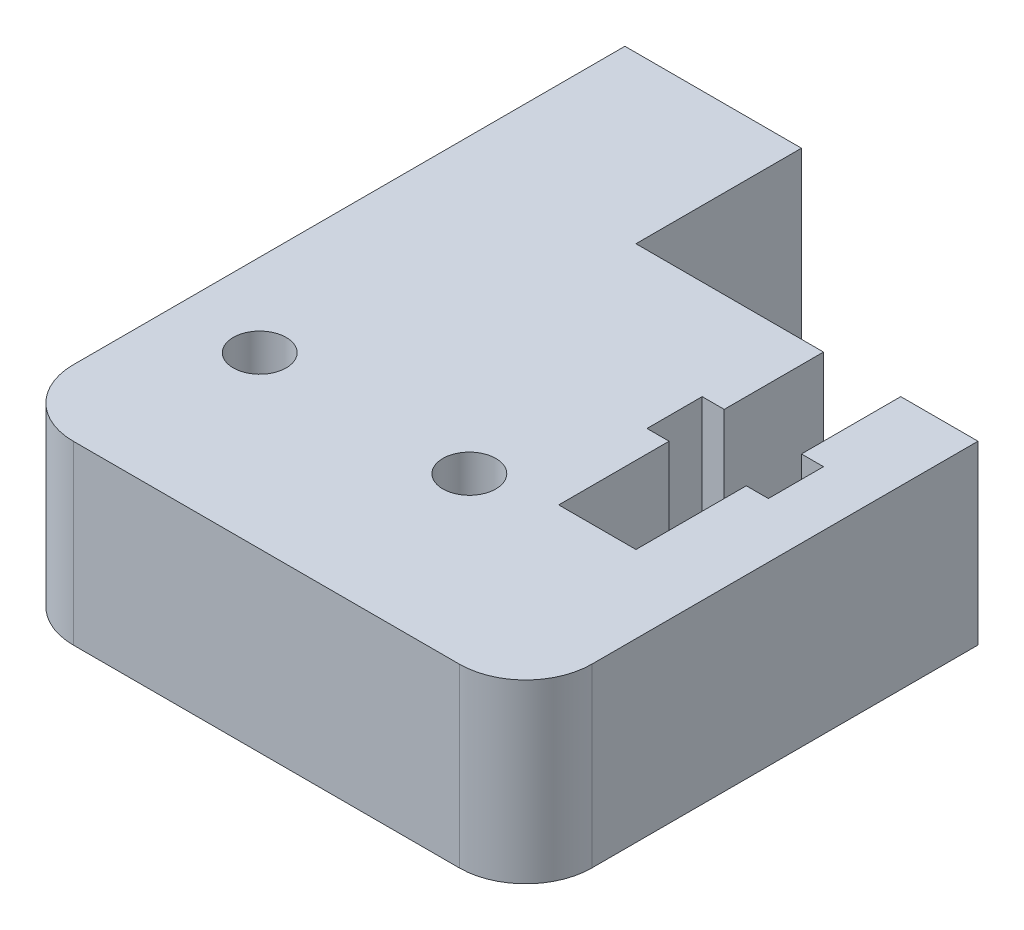
ISO-10303-21;
HEADER;
FILE_DESCRIPTION(('STEP AP214'),'2;1');
FILE_NAME('part.step','',(''),(''),'','','');
FILE_SCHEMA(('AUTOMOTIVE_DESIGN { 1 0 10303 214 1 1 1 1 }'));
ENDSEC;
DATA;
#1=APPLICATION_CONTEXT('core data for automotive mechanical design processes');
#2=APPLICATION_PROTOCOL_DEFINITION('international standard','automotive_design',2000,#1);
#3=PRODUCT_CONTEXT('',#1,'mechanical');
#4=PRODUCT('Part','Part','',(#3));
#5=PRODUCT_RELATED_PRODUCT_CATEGORY('part','',(#4));
#6=PRODUCT_DEFINITION_FORMATION('','',#4);
#7=PRODUCT_DEFINITION_CONTEXT('part definition',#1,'design');
#8=PRODUCT_DEFINITION('design','',#6,#7);
#9=PRODUCT_DEFINITION_SHAPE('','',#8);
#10=(LENGTH_UNIT() NAMED_UNIT(*) SI_UNIT(.MILLI.,.METRE.));
#11=(NAMED_UNIT(*) PLANE_ANGLE_UNIT() SI_UNIT($,.RADIAN.));
#12=(NAMED_UNIT(*) SI_UNIT($,.STERADIAN.) SOLID_ANGLE_UNIT());
#13=UNCERTAINTY_MEASURE_WITH_UNIT(LENGTH_MEASURE(1.E-05),#10,'distance_accuracy_value','');
#14=(GEOMETRIC_REPRESENTATION_CONTEXT(3) GLOBAL_UNCERTAINTY_ASSIGNED_CONTEXT((#13)) GLOBAL_UNIT_ASSIGNED_CONTEXT((#10,
#11,#12)) REPRESENTATION_CONTEXT('',''));
#15=CARTESIAN_POINT('',(0.,0.,0.));
#16=DIRECTION('',(0.,0.,1.));
#17=DIRECTION('',(1.,0.,0.));
#18=AXIS2_PLACEMENT_3D('',#15,#16,#17);
#19=CARTESIAN_POINT('',(30.4198055675083,8.,-12.9696334852867));
#20=DIRECTION('',(0.,1.,0.));
#21=DIRECTION('',(0.,0.,1.));
#22=AXIS2_PLACEMENT_3D('',#19,#20,#21);
#23=PLANE('',#22);
#24=CARTESIAN_POINT('',(23.1698055675083,8.,-17.6696334852865));
#25=DIRECTION('',(0.,1.,0.));
#26=DIRECTION('',(0.,0.,1.));
#27=AXIS2_PLACEMENT_3D('',#24,#25,#26);
#28=CIRCLE('',#27,1.2);
#29=CARTESIAN_POINT('',(23.1698055675083,8.,-16.4696334852865));
#30=VERTEX_POINT('',#29);
#31=EDGE_CURVE('E210',#30,#30,#28,.T.);
#32=ORIENTED_EDGE('',*,*,#31,.F.);
#33=EDGE_LOOP('',(#32));
#34=FACE_BOUND('',#33,.T.);
#35=DIRECTION('',(-1.,0.,0.));
#36=VECTOR('',#35,1.);
#37=CARTESIAN_POINT('',(17.9198055675083,8.,-30.4696334852867));
#38=LINE('',#37,#36);
#39=CARTESIAN_POINT('',(26.4198055675083,8.,-30.4696334852867));
#40=VERTEX_POINT('',#39);
#41=CARTESIAN_POINT('',(17.9198055675083,8.,-30.4696334852867));
#42=VERTEX_POINT('',#41);
#43=EDGE_CURVE('E246',#40,#42,#38,.T.);
#44=ORIENTED_EDGE('',*,*,#43,.T.);
#45=DIRECTION('',(0.,0.,-1.));
#46=VECTOR('',#45,1.);
#47=CARTESIAN_POINT('',(17.9198055675083,8.,-37.9696334852867));
#48=LINE('',#47,#46);
#49=CARTESIAN_POINT('',(17.9198055675083,8.,-37.9696334852867));
#50=VERTEX_POINT('',#49);
#51=EDGE_CURVE('E133',#42,#50,#48,.T.);
#52=ORIENTED_EDGE('',*,*,#51,.T.);
#53=DIRECTION('',(-1.,0.,0.));
#54=VECTOR('',#53,1.);
#55=CARTESIAN_POINT('',(9.91980556750833,8.,-37.9696334852867));
#56=LINE('',#55,#54);
#57=CARTESIAN_POINT('',(9.91980556750833,8.,-37.9696334852867));
#58=VERTEX_POINT('',#57);
#59=EDGE_CURVE('E297',#50,#58,#56,.T.);
#60=ORIENTED_EDGE('',*,*,#59,.T.);
#61=DIRECTION('',(0.,0.,1.));
#62=VECTOR('',#61,1.);
#63=CARTESIAN_POINT('',(9.91980556750833,8.,-30.4696334852867));
#64=LINE('',#63,#62);
#65=CARTESIAN_POINT('',(9.91980556750833,8.,-12.9696334852867));
#66=VERTEX_POINT('',#65);
#67=EDGE_CURVE('E315',#58,#66,#64,.T.);
#68=ORIENTED_EDGE('',*,*,#67,.T.);
#69=CARTESIAN_POINT('',(12.9198055675083,8.,-12.9696334852867));
#70=DIRECTION('',(0.,1.,0.));
#71=DIRECTION('',(0.,0.,1.));
#72=AXIS2_PLACEMENT_3D('',#69,#70,#71);
#73=CIRCLE('',#72,3.);
#74=CARTESIAN_POINT('',(12.9198055675083,8.,-9.96963348528671));
#75=VERTEX_POINT('',#74);
#76=EDGE_CURVE('E312',#66,#75,#73,.T.);
#77=ORIENTED_EDGE('',*,*,#76,.T.);
#78=DIRECTION('',(1.,0.,0.));
#79=VECTOR('',#78,1.);
#80=CARTESIAN_POINT('',(30.4198055675083,8.,-9.96963348528671));
#81=LINE('',#80,#79);
#82=CARTESIAN_POINT('',(30.4198055675083,8.,-9.96963348528671));
#83=VERTEX_POINT('',#82);
#84=EDGE_CURVE('E314',#75,#83,#81,.T.);
#85=ORIENTED_EDGE('',*,*,#84,.T.);
#86=CARTESIAN_POINT('',(30.4198055675083,8.,-12.9696334852867));
#87=DIRECTION('',(0.,1.,0.));
#88=DIRECTION('',(0.,0.,1.));
#89=AXIS2_PLACEMENT_3D('',#86,#87,#88);
#90=CIRCLE('',#89,3.);
#91=CARTESIAN_POINT('',(33.4198055675083,8.,-12.9696334852867));
#92=VERTEX_POINT('',#91);
#93=EDGE_CURVE('E317',#83,#92,#90,.T.);
#94=ORIENTED_EDGE('',*,*,#93,.T.);
#95=DIRECTION('',(0.,0.,-1.));
#96=VECTOR('',#95,1.);
#97=CARTESIAN_POINT('',(33.4198055675083,8.,-30.4696334852867));
#98=LINE('',#97,#96);
#99=CARTESIAN_POINT('',(33.4198055675083,8.,-30.4696334852867));
#100=VERTEX_POINT('',#99);
#101=EDGE_CURVE('E323',#92,#100,#98,.T.);
#102=ORIENTED_EDGE('',*,*,#101,.T.);
#103=DIRECTION('',(-1.,0.,0.));
#104=VECTOR('',#103,1.);
#105=CARTESIAN_POINT('',(29.9198055675083,8.,-30.4696334852867));
#106=LINE('',#105,#104);
#107=CARTESIAN_POINT('',(29.9198055675083,8.,-30.4696334852867));
#108=VERTEX_POINT('',#107);
#109=EDGE_CURVE('E325',#100,#108,#106,.T.);
#110=ORIENTED_EDGE('',*,*,#109,.T.);
#111=DIRECTION('',(0.,0.,1.));
#112=VECTOR('',#111,1.);
#113=CARTESIAN_POINT('',(29.9198055675083,8.,-25.9696334852867));
#114=LINE('',#113,#112);
#115=CARTESIAN_POINT('',(29.9198055675083,8.,-25.9696334852867));
#116=VERTEX_POINT('',#115);
#117=EDGE_CURVE('E327',#108,#116,#114,.T.);
#118=ORIENTED_EDGE('',*,*,#117,.T.);
#119=DIRECTION('',(1.,0.,0.));
#120=VECTOR('',#119,1.);
#121=CARTESIAN_POINT('',(30.9198055675083,8.,-25.9696334852867));
#122=LINE('',#121,#120);
#123=CARTESIAN_POINT('',(30.9198055675083,8.,-25.9696334852867));
#124=VERTEX_POINT('',#123);
#125=EDGE_CURVE('E329',#116,#124,#122,.T.);
#126=ORIENTED_EDGE('',*,*,#125,.T.);
#127=DIRECTION('',(0.,0.,1.));
#128=VECTOR('',#127,1.);
#129=CARTESIAN_POINT('',(30.9198055675083,8.,-23.4696334852867));
#130=LINE('',#129,#128);
#131=CARTESIAN_POINT('',(30.9198055675083,8.,-23.4696334852867));
#132=VERTEX_POINT('',#131);
#133=EDGE_CURVE('E331',#124,#132,#130,.T.);
#134=ORIENTED_EDGE('',*,*,#133,.T.);
#135=DIRECTION('',(-1.,0.,0.));
#136=VECTOR('',#135,1.);
#137=CARTESIAN_POINT('',(29.9198055675083,8.,-23.4696334852867));
#138=LINE('',#137,#136);
#139=CARTESIAN_POINT('',(29.9198055675083,8.,-23.4696334852867));
#140=VERTEX_POINT('',#139);
#141=EDGE_CURVE('E333',#132,#140,#138,.T.);
#142=ORIENTED_EDGE('',*,*,#141,.T.);
#143=DIRECTION('',(0.,0.,1.));
#144=VECTOR('',#143,1.);
#145=CARTESIAN_POINT('',(29.9198055675083,8.,-18.4696334852867));
#146=LINE('',#145,#144);
#147=CARTESIAN_POINT('',(29.9198055675083,8.,-18.4696334852867));
#148=VERTEX_POINT('',#147);
#149=EDGE_CURVE('E335',#140,#148,#146,.T.);
#150=ORIENTED_EDGE('',*,*,#149,.T.);
#151=DIRECTION('',(-1.,0.,0.));
#152=VECTOR('',#151,1.);
#153=CARTESIAN_POINT('',(26.4198055675083,8.,-18.4696334852867));
#154=LINE('',#153,#152);
#155=CARTESIAN_POINT('',(26.4198055675083,8.,-18.4696334852867));
#156=VERTEX_POINT('',#155);
#157=EDGE_CURVE('E337',#148,#156,#154,.T.);
#158=ORIENTED_EDGE('',*,*,#157,.T.);
#159=DIRECTION('',(0.,0.,-1.));
#160=VECTOR('',#159,1.);
#161=CARTESIAN_POINT('',(26.4198055675083,8.,-23.4696334852867));
#162=LINE('',#161,#160);
#163=CARTESIAN_POINT('',(26.4198055675083,8.,-23.4696334852867));
#164=VERTEX_POINT('',#163);
#165=EDGE_CURVE('E339',#156,#164,#162,.T.);
#166=ORIENTED_EDGE('',*,*,#165,.T.);
#167=DIRECTION('',(-1.,0.,0.));
#168=VECTOR('',#167,1.);
#169=CARTESIAN_POINT('',(25.4198055675083,8.,-23.4696334852867));
#170=LINE('',#169,#168);
#171=CARTESIAN_POINT('',(25.4198055675083,8.,-23.4696334852867));
#172=VERTEX_POINT('',#171);
#173=EDGE_CURVE('E188',#164,#172,#170,.T.);
#174=ORIENTED_EDGE('',*,*,#173,.T.);
#175=DIRECTION('',(0.,0.,-1.));
#176=VECTOR('',#175,1.);
#177=CARTESIAN_POINT('',(25.4198055675083,8.,-25.9696334852867));
#178=LINE('',#177,#176);
#179=CARTESIAN_POINT('',(25.4198055675083,8.,-25.9696334852867));
#180=VERTEX_POINT('',#179);
#181=EDGE_CURVE('E182',#172,#180,#178,.T.);
#182=ORIENTED_EDGE('',*,*,#181,.T.);
#183=DIRECTION('',(1.,0.,0.));
#184=VECTOR('',#183,1.);
#185=CARTESIAN_POINT('',(26.4198055675083,8.,-25.9696334852867));
#186=LINE('',#185,#184);
#187=CARTESIAN_POINT('',(26.4198055675083,8.,-25.9696334852867));
#188=VERTEX_POINT('',#187);
#189=EDGE_CURVE('E186',#180,#188,#186,.T.);
#190=ORIENTED_EDGE('',*,*,#189,.T.);
#191=DIRECTION('',(0.,0.,-1.));
#192=VECTOR('',#191,1.);
#193=CARTESIAN_POINT('',(26.4198055675083,8.,-30.4696334852867));
#194=LINE('',#193,#192);
#195=EDGE_CURVE('E54',#188,#40,#194,.T.);
#196=ORIENTED_EDGE('',*,*,#195,.T.);
#197=EDGE_LOOP('',(#44,#52,#60,#68,#77,#85,#94,#102,#110,#118,#126,#134,#142,#150,#158,#166,
#174,#182,#190,#196));
#198=FACE_BOUND('',#197,.T.);
#199=CARTESIAN_POINT('',(13.6698055675083,8.,-17.6696334852865));
#200=DIRECTION('',(0.,1.,0.));
#201=DIRECTION('',(0.,0.,1.));
#202=AXIS2_PLACEMENT_3D('',#199,#200,#201);
#203=CIRCLE('',#202,1.2);
#204=CARTESIAN_POINT('',(13.6698055675083,8.,-16.4696334852865));
#205=VERTEX_POINT('',#204);
#206=EDGE_CURVE('E394',#205,#205,#203,.T.);
#207=ORIENTED_EDGE('',*,*,#206,.F.);
#208=EDGE_LOOP('',(#207));
#209=FACE_BOUND('',#208,.T.);
#210=ADVANCED_FACE('F37',(#34,#198,#209),#23,.T.);
#211=CARTESIAN_POINT('',(30.4198055675083,0.,-12.9696334852867));
#212=DIRECTION('',(0.,1.,0.));
#213=DIRECTION('',(0.,0.,1.));
#214=AXIS2_PLACEMENT_3D('',#211,#212,#213);
#215=PLANE('',#214);
#216=CARTESIAN_POINT('',(23.1698055675083,0.,-17.6696334852865));
#217=DIRECTION('',(0.,1.,0.));
#218=DIRECTION('',(0.,0.,1.));
#219=AXIS2_PLACEMENT_3D('',#216,#217,#218);
#220=CIRCLE('',#219,1.2);
#221=CARTESIAN_POINT('',(23.1698055675083,0.,-16.4696334852865));
#222=VERTEX_POINT('',#221);
#223=EDGE_CURVE('E400',#222,#222,#220,.T.);
#224=ORIENTED_EDGE('',*,*,#223,.T.);
#225=EDGE_LOOP('',(#224));
#226=FACE_BOUND('',#225,.T.);
#227=DIRECTION('',(-1.,0.,0.));
#228=VECTOR('',#227,1.);
#229=CARTESIAN_POINT('',(17.9198055675083,0.,-30.4696334852867));
#230=LINE('',#229,#228);
#231=CARTESIAN_POINT('',(26.4198055675083,0.,-30.4696334852867));
#232=VERTEX_POINT('',#231);
#233=CARTESIAN_POINT('',(17.9198055675083,0.,-30.4696334852867));
#234=VERTEX_POINT('',#233);
#235=EDGE_CURVE('E206',#232,#234,#230,.T.);
#236=ORIENTED_EDGE('',*,*,#235,.F.);
#237=DIRECTION('',(0.,0.,-1.));
#238=VECTOR('',#237,1.);
#239=CARTESIAN_POINT('',(26.4198055675083,0.,-30.4696334852867));
#240=LINE('',#239,#238);
#241=CARTESIAN_POINT('',(26.4198055675083,0.,-25.9696334852867));
#242=VERTEX_POINT('',#241);
#243=EDGE_CURVE('E125',#242,#232,#240,.T.);
#244=ORIENTED_EDGE('',*,*,#243,.F.);
#245=DIRECTION('',(1.,0.,0.));
#246=VECTOR('',#245,1.);
#247=CARTESIAN_POINT('',(26.4198055675083,0.,-25.9696334852867));
#248=LINE('',#247,#246);
#249=CARTESIAN_POINT('',(25.4198055675083,0.,-25.9696334852867));
#250=VERTEX_POINT('',#249);
#251=EDGE_CURVE('E119',#250,#242,#248,.T.);
#252=ORIENTED_EDGE('',*,*,#251,.F.);
#253=DIRECTION('',(0.,0.,-1.));
#254=VECTOR('',#253,1.);
#255=CARTESIAN_POINT('',(25.4198055675083,0.,-25.9696334852867));
#256=LINE('',#255,#254);
#257=CARTESIAN_POINT('',(25.4198055675083,0.,-23.4696334852867));
#258=VERTEX_POINT('',#257);
#259=EDGE_CURVE('E196',#258,#250,#256,.T.);
#260=ORIENTED_EDGE('',*,*,#259,.F.);
#261=DIRECTION('',(-1.,0.,0.));
#262=VECTOR('',#261,1.);
#263=CARTESIAN_POINT('',(25.4198055675083,0.,-23.4696334852867));
#264=LINE('',#263,#262);
#265=CARTESIAN_POINT('',(26.4198055675083,0.,-23.4696334852867));
#266=VERTEX_POINT('',#265);
#267=EDGE_CURVE('E241',#266,#258,#264,.T.);
#268=ORIENTED_EDGE('',*,*,#267,.F.);
#269=DIRECTION('',(0.,0.,-1.));
#270=VECTOR('',#269,1.);
#271=CARTESIAN_POINT('',(26.4198055675083,0.,-23.4696334852867));
#272=LINE('',#271,#270);
#273=CARTESIAN_POINT('',(26.4198055675083,0.,-18.4696334852867));
#274=VERTEX_POINT('',#273);
#275=EDGE_CURVE('E239',#274,#266,#272,.T.);
#276=ORIENTED_EDGE('',*,*,#275,.F.);
#277=DIRECTION('',(-1.,0.,0.));
#278=VECTOR('',#277,1.);
#279=CARTESIAN_POINT('',(26.4198055675083,0.,-18.4696334852867));
#280=LINE('',#279,#278);
#281=CARTESIAN_POINT('',(29.9198055675083,0.,-18.4696334852867));
#282=VERTEX_POINT('',#281);
#283=EDGE_CURVE('E237',#282,#274,#280,.T.);
#284=ORIENTED_EDGE('',*,*,#283,.F.);
#285=DIRECTION('',(0.,0.,1.));
#286=VECTOR('',#285,1.);
#287=CARTESIAN_POINT('',(29.9198055675083,0.,-18.4696334852867));
#288=LINE('',#287,#286);
#289=CARTESIAN_POINT('',(29.9198055675083,0.,-23.4696334852867));
#290=VERTEX_POINT('',#289);
#291=EDGE_CURVE('E235',#290,#282,#288,.T.);
#292=ORIENTED_EDGE('',*,*,#291,.F.);
#293=DIRECTION('',(-1.,0.,0.));
#294=VECTOR('',#293,1.);
#295=CARTESIAN_POINT('',(29.9198055675083,0.,-23.4696334852867));
#296=LINE('',#295,#294);
#297=CARTESIAN_POINT('',(30.9198055675083,0.,-23.4696334852867));
#298=VERTEX_POINT('',#297);
#299=EDGE_CURVE('E233',#298,#290,#296,.T.);
#300=ORIENTED_EDGE('',*,*,#299,.F.);
#301=DIRECTION('',(0.,0.,1.));
#302=VECTOR('',#301,1.);
#303=CARTESIAN_POINT('',(30.9198055675083,0.,-23.4696334852867));
#304=LINE('',#303,#302);
#305=CARTESIAN_POINT('',(30.9198055675083,0.,-25.9696334852867));
#306=VERTEX_POINT('',#305);
#307=EDGE_CURVE('E231',#306,#298,#304,.T.);
#308=ORIENTED_EDGE('',*,*,#307,.F.);
#309=DIRECTION('',(1.,0.,0.));
#310=VECTOR('',#309,1.);
#311=CARTESIAN_POINT('',(30.9198055675083,0.,-25.9696334852867));
#312=LINE('',#311,#310);
#313=CARTESIAN_POINT('',(29.9198055675083,0.,-25.9696334852867));
#314=VERTEX_POINT('',#313);
#315=EDGE_CURVE('E229',#314,#306,#312,.T.);
#316=ORIENTED_EDGE('',*,*,#315,.F.);
#317=DIRECTION('',(0.,0.,1.));
#318=VECTOR('',#317,1.);
#319=CARTESIAN_POINT('',(29.9198055675083,0.,-25.9696334852867));
#320=LINE('',#319,#318);
#321=CARTESIAN_POINT('',(29.9198055675083,0.,-30.4696334852867));
#322=VERTEX_POINT('',#321);
#323=EDGE_CURVE('E227',#322,#314,#320,.T.);
#324=ORIENTED_EDGE('',*,*,#323,.F.);
#325=DIRECTION('',(-1.,0.,0.));
#326=VECTOR('',#325,1.);
#327=CARTESIAN_POINT('',(29.9198055675083,0.,-30.4696334852867));
#328=LINE('',#327,#326);
#329=CARTESIAN_POINT('',(33.4198055675083,0.,-30.4696334852867));
#330=VERTEX_POINT('',#329);
#331=EDGE_CURVE('E225',#330,#322,#328,.T.);
#332=ORIENTED_EDGE('',*,*,#331,.F.);
#333=DIRECTION('',(0.,0.,-1.));
#334=VECTOR('',#333,1.);
#335=CARTESIAN_POINT('',(33.4198055675083,0.,-30.4696334852867));
#336=LINE('',#335,#334);
#337=CARTESIAN_POINT('',(33.4198055675083,0.,-12.9696334852867));
#338=VERTEX_POINT('',#337);
#339=EDGE_CURVE('E223',#338,#330,#336,.T.);
#340=ORIENTED_EDGE('',*,*,#339,.F.);
#341=CARTESIAN_POINT('',(30.4198055675083,0.,-12.9696334852867));
#342=DIRECTION('',(0.,1.,0.));
#343=DIRECTION('',(0.,0.,1.));
#344=AXIS2_PLACEMENT_3D('',#341,#342,#343);
#345=CIRCLE('',#344,3.);
#346=CARTESIAN_POINT('',(30.4198055675083,0.,-9.96963348528671));
#347=VERTEX_POINT('',#346);
#348=EDGE_CURVE('E221',#347,#338,#345,.T.);
#349=ORIENTED_EDGE('',*,*,#348,.F.);
#350=DIRECTION('',(1.,0.,0.));
#351=VECTOR('',#350,1.);
#352=CARTESIAN_POINT('',(30.4198055675083,0.,-9.96963348528671));
#353=LINE('',#352,#351);
#354=CARTESIAN_POINT('',(12.9198055675083,0.,-9.96963348528671));
#355=VERTEX_POINT('',#354);
#356=EDGE_CURVE('E219',#355,#347,#353,.T.);
#357=ORIENTED_EDGE('',*,*,#356,.F.);
#358=CARTESIAN_POINT('',(12.9198055675083,0.,-12.9696334852867));
#359=DIRECTION('',(0.,1.,0.));
#360=DIRECTION('',(0.,0.,1.));
#361=AXIS2_PLACEMENT_3D('',#358,#359,#360);
#362=CIRCLE('',#361,3.);
#363=CARTESIAN_POINT('',(9.91980556750833,0.,-12.9696334852867));
#364=VERTEX_POINT('',#363);
#365=EDGE_CURVE('E217',#364,#355,#362,.T.);
#366=ORIENTED_EDGE('',*,*,#365,.F.);
#367=DIRECTION('',(0.,0.,1.));
#368=VECTOR('',#367,1.);
#369=CARTESIAN_POINT('',(9.91980556750833,0.,-12.9696334852867));
#370=LINE('',#369,#368);
#371=CARTESIAN_POINT('',(9.91980556750833,0.,-37.9696334852867));
#372=VERTEX_POINT('',#371);
#373=EDGE_CURVE('E215',#372,#364,#370,.T.);
#374=ORIENTED_EDGE('',*,*,#373,.F.);
#375=DIRECTION('',(-1.,0.,0.));
#376=VECTOR('',#375,1.);
#377=CARTESIAN_POINT('',(9.91980556750833,0.,-37.9696334852867));
#378=LINE('',#377,#376);
#379=CARTESIAN_POINT('',(17.9198055675083,0.,-37.9696334852867));
#380=VERTEX_POINT('',#379);
#381=EDGE_CURVE('E212',#380,#372,#378,.T.);
#382=ORIENTED_EDGE('',*,*,#381,.F.);
#383=DIRECTION('',(0.,0.,-1.));
#384=VECTOR('',#383,1.);
#385=CARTESIAN_POINT('',(17.9198055675083,0.,-37.9696334852867));
#386=LINE('',#385,#384);
#387=EDGE_CURVE('E209',#234,#380,#386,.T.);
#388=ORIENTED_EDGE('',*,*,#387,.F.);
#389=EDGE_LOOP('',(#236,#244,#252,#260,#268,#276,#284,#292,#300,#308,#316,#324,#332,#340,#349,
#357,#366,#374,#382,#388));
#390=FACE_BOUND('',#389,.T.);
#391=CARTESIAN_POINT('',(13.6698055675083,0.,-17.6696334852865));
#392=DIRECTION('',(0.,1.,0.));
#393=DIRECTION('',(0.,0.,1.));
#394=AXIS2_PLACEMENT_3D('',#391,#392,#393);
#395=CIRCLE('',#394,1.2);
#396=CARTESIAN_POINT('',(13.6698055675083,0.,-16.4696334852865));
#397=VERTEX_POINT('',#396);
#398=EDGE_CURVE('E390',#397,#397,#395,.T.);
#399=ORIENTED_EDGE('',*,*,#398,.T.);
#400=EDGE_LOOP('',(#399));
#401=FACE_BOUND('',#400,.T.);
#402=ADVANCED_FACE('F300',(#226,#390,#401),#215,.F.);
#403=CARTESIAN_POINT('',(17.9198055675083,8.,-30.4696334852867));
#404=DIRECTION('',(0.,0.,1.));
#405=DIRECTION('',(1.,0.,0.));
#406=AXIS2_PLACEMENT_3D('',#403,#404,#405);
#407=PLANE('',#406);
#408=ORIENTED_EDGE('',*,*,#235,.T.);
#409=DIRECTION('',(0.,-1.,0.));
#410=VECTOR('',#409,1.);
#411=CARTESIAN_POINT('',(17.9198055675083,8.,-30.4696334852867));
#412=LINE('',#411,#410);
#413=EDGE_CURVE('E11',#42,#234,#412,.T.);
#414=ORIENTED_EDGE('',*,*,#413,.F.);
#415=ORIENTED_EDGE('',*,*,#43,.F.);
#416=DIRECTION('',(0.,-1.,0.));
#417=VECTOR('',#416,1.);
#418=CARTESIAN_POINT('',(26.4198055675083,8.,-30.4696334852867));
#419=LINE('',#418,#417);
#420=EDGE_CURVE('E202',#40,#232,#419,.T.);
#421=ORIENTED_EDGE('',*,*,#420,.T.);
#422=EDGE_LOOP('',(#408,#414,#415,#421));
#423=FACE_BOUND('',#422,.T.);
#424=ADVANCED_FACE('F39',(#423),#407,.F.);
#425=CARTESIAN_POINT('',(17.9198055675083,8.,-37.9696334852867));
#426=DIRECTION('',(-1.,0.,0.));
#427=DIRECTION('',(0.,0.,1.));
#428=AXIS2_PLACEMENT_3D('',#425,#426,#427);
#429=PLANE('',#428);
#430=ORIENTED_EDGE('',*,*,#387,.T.);
#431=DIRECTION('',(0.,-1.,0.));
#432=VECTOR('',#431,1.);
#433=CARTESIAN_POINT('',(17.9198055675083,8.,-37.9696334852867));
#434=LINE('',#433,#432);
#435=EDGE_CURVE('E46',#50,#380,#434,.T.);
#436=ORIENTED_EDGE('',*,*,#435,.F.);
#437=ORIENTED_EDGE('',*,*,#51,.F.);
#438=ORIENTED_EDGE('',*,*,#413,.T.);
#439=EDGE_LOOP('',(#430,#436,#437,#438));
#440=FACE_BOUND('',#439,.T.);
#441=ADVANCED_FACE('F476',(#440),#429,.F.);
#442=CARTESIAN_POINT('',(9.91980556750833,8.,-37.9696334852867));
#443=DIRECTION('',(0.,0.,1.));
#444=DIRECTION('',(1.,0.,0.));
#445=AXIS2_PLACEMENT_3D('',#442,#443,#444);
#446=PLANE('',#445);
#447=ORIENTED_EDGE('',*,*,#381,.T.);
#448=DIRECTION('',(0.,-1.,0.));
#449=VECTOR('',#448,1.);
#450=CARTESIAN_POINT('',(9.91980556750833,8.,-37.9696334852867));
#451=LINE('',#450,#449);
#452=EDGE_CURVE('E289',#58,#372,#451,.T.);
#453=ORIENTED_EDGE('',*,*,#452,.F.);
#454=ORIENTED_EDGE('',*,*,#59,.F.);
#455=ORIENTED_EDGE('',*,*,#435,.T.);
#456=EDGE_LOOP('',(#447,#453,#454,#455));
#457=FACE_BOUND('',#456,.T.);
#458=ADVANCED_FACE('F295',(#457),#446,.F.);
#459=CARTESIAN_POINT('',(9.91980556750833,8.,-12.9696334852867));
#460=DIRECTION('',(1.,0.,0.));
#461=DIRECTION('',(0.,0.,-1.));
#462=AXIS2_PLACEMENT_3D('',#459,#460,#461);
#463=PLANE('',#462);
#464=ORIENTED_EDGE('',*,*,#373,.T.);
#465=DIRECTION('',(0.,-1.,0.));
#466=VECTOR('',#465,1.);
#467=CARTESIAN_POINT('',(9.91980556750833,8.,-12.9696334852867));
#468=LINE('',#467,#466);
#469=EDGE_CURVE('E286',#66,#364,#468,.T.);
#470=ORIENTED_EDGE('',*,*,#469,.F.);
#471=ORIENTED_EDGE('',*,*,#67,.F.);
#472=ORIENTED_EDGE('',*,*,#452,.T.);
#473=EDGE_LOOP('',(#464,#470,#471,#472));
#474=FACE_BOUND('',#473,.T.);
#475=ADVANCED_FACE('F306',(#474),#463,.F.);
#476=CARTESIAN_POINT('',(12.9198055675083,8.,-12.9696334852867));
#477=DIRECTION('',(0.,-1.,0.));
#478=DIRECTION('',(0.,0.,-1.));
#479=AXIS2_PLACEMENT_3D('',#476,#477,#478);
#480=CYLINDRICAL_SURFACE('',#479,3.);
#481=ORIENTED_EDGE('',*,*,#365,.T.);
#482=DIRECTION('',(0.,-1.,0.));
#483=VECTOR('',#482,1.);
#484=CARTESIAN_POINT('',(12.9198055675083,8.,-9.96963348528671));
#485=LINE('',#484,#483);
#486=EDGE_CURVE('E283',#75,#355,#485,.T.);
#487=ORIENTED_EDGE('',*,*,#486,.F.);
#488=ORIENTED_EDGE('',*,*,#76,.F.);
#489=ORIENTED_EDGE('',*,*,#469,.T.);
#490=EDGE_LOOP('',(#481,#487,#488,#489));
#491=FACE_BOUND('',#490,.T.);
#492=ADVANCED_FACE('F310',(#491),#480,.T.);
#493=CARTESIAN_POINT('',(30.4198055675083,8.,-9.96963348528671));
#494=DIRECTION('',(0.,0.,-1.));
#495=DIRECTION('',(-1.,0.,0.));
#496=AXIS2_PLACEMENT_3D('',#493,#494,#495);
#497=PLANE('',#496);
#498=ORIENTED_EDGE('',*,*,#356,.T.);
#499=DIRECTION('',(0.,-1.,0.));
#500=VECTOR('',#499,1.);
#501=CARTESIAN_POINT('',(30.4198055675083,8.,-9.96963348528671));
#502=LINE('',#501,#500);
#503=EDGE_CURVE('E280',#83,#347,#502,.T.);
#504=ORIENTED_EDGE('',*,*,#503,.F.);
#505=ORIENTED_EDGE('',*,*,#84,.F.);
#506=ORIENTED_EDGE('',*,*,#486,.T.);
#507=EDGE_LOOP('',(#498,#504,#505,#506));
#508=FACE_BOUND('',#507,.T.);
#509=ADVANCED_FACE('F462',(#508),#497,.F.);
#510=CARTESIAN_POINT('',(30.4198055675083,8.,-12.9696334852867));
#511=DIRECTION('',(0.,-1.,0.));
#512=DIRECTION('',(0.,0.,-1.));
#513=AXIS2_PLACEMENT_3D('',#510,#511,#512);
#514=CYLINDRICAL_SURFACE('',#513,3.);
#515=ORIENTED_EDGE('',*,*,#348,.T.);
#516=DIRECTION('',(0.,-1.,0.));
#517=VECTOR('',#516,1.);
#518=CARTESIAN_POINT('',(33.4198055675083,8.,-12.9696334852867));
#519=LINE('',#518,#517);
#520=EDGE_CURVE('E277',#92,#338,#519,.T.);
#521=ORIENTED_EDGE('',*,*,#520,.F.);
#522=ORIENTED_EDGE('',*,*,#93,.F.);
#523=ORIENTED_EDGE('',*,*,#503,.T.);
#524=EDGE_LOOP('',(#515,#521,#522,#523));
#525=FACE_BOUND('',#524,.T.);
#526=ADVANCED_FACE('F459',(#525),#514,.T.);
#527=CARTESIAN_POINT('',(33.4198055675083,8.,-30.4696334852867));
#528=DIRECTION('',(-1.,0.,0.));
#529=DIRECTION('',(0.,0.,1.));
#530=AXIS2_PLACEMENT_3D('',#527,#528,#529);
#531=PLANE('',#530);
#532=ORIENTED_EDGE('',*,*,#339,.T.);
#533=DIRECTION('',(0.,-1.,0.));
#534=VECTOR('',#533,1.);
#535=CARTESIAN_POINT('',(33.4198055675083,8.,-30.4696334852867));
#536=LINE('',#535,#534);
#537=EDGE_CURVE('E274',#100,#330,#536,.T.);
#538=ORIENTED_EDGE('',*,*,#537,.F.);
#539=ORIENTED_EDGE('',*,*,#101,.F.);
#540=ORIENTED_EDGE('',*,*,#520,.T.);
#541=EDGE_LOOP('',(#532,#538,#539,#540));
#542=FACE_BOUND('',#541,.T.);
#543=ADVANCED_FACE('F454',(#542),#531,.F.);
#544=CARTESIAN_POINT('',(29.9198055675083,8.,-30.4696334852867));
#545=DIRECTION('',(0.,0.,1.));
#546=DIRECTION('',(1.,0.,0.));
#547=AXIS2_PLACEMENT_3D('',#544,#545,#546);
#548=PLANE('',#547);
#549=ORIENTED_EDGE('',*,*,#331,.T.);
#550=DIRECTION('',(0.,-1.,0.));
#551=VECTOR('',#550,1.);
#552=CARTESIAN_POINT('',(29.9198055675083,8.,-30.4696334852867));
#553=LINE('',#552,#551);
#554=EDGE_CURVE('E271',#108,#322,#553,.T.);
#555=ORIENTED_EDGE('',*,*,#554,.F.);
#556=ORIENTED_EDGE('',*,*,#109,.F.);
#557=ORIENTED_EDGE('',*,*,#537,.T.);
#558=EDGE_LOOP('',(#549,#555,#556,#557));
#559=FACE_BOUND('',#558,.T.);
#560=ADVANCED_FACE('F449',(#559),#548,.F.);
#561=CARTESIAN_POINT('',(29.9198055675083,8.,-25.9696334852867));
#562=DIRECTION('',(1.,0.,0.));
#563=DIRECTION('',(0.,0.,-1.));
#564=AXIS2_PLACEMENT_3D('',#561,#562,#563);
#565=PLANE('',#564);
#566=ORIENTED_EDGE('',*,*,#323,.T.);
#567=DIRECTION('',(0.,-1.,0.));
#568=VECTOR('',#567,1.);
#569=CARTESIAN_POINT('',(29.9198055675083,8.,-25.9696334852867));
#570=LINE('',#569,#568);
#571=EDGE_CURVE('E268',#116,#314,#570,.T.);
#572=ORIENTED_EDGE('',*,*,#571,.F.);
#573=ORIENTED_EDGE('',*,*,#117,.F.);
#574=ORIENTED_EDGE('',*,*,#554,.T.);
#575=EDGE_LOOP('',(#566,#572,#573,#574));
#576=FACE_BOUND('',#575,.T.);
#577=ADVANCED_FACE('F445',(#576),#565,.F.);
#578=CARTESIAN_POINT('',(30.9198055675083,8.,-25.9696334852867));
#579=DIRECTION('',(0.,0.,-1.));
#580=DIRECTION('',(-1.,0.,0.));
#581=AXIS2_PLACEMENT_3D('',#578,#579,#580);
#582=PLANE('',#581);
#583=ORIENTED_EDGE('',*,*,#315,.T.);
#584=DIRECTION('',(0.,-1.,0.));
#585=VECTOR('',#584,1.);
#586=CARTESIAN_POINT('',(30.9198055675083,8.,-25.9696334852867));
#587=LINE('',#586,#585);
#588=EDGE_CURVE('E265',#124,#306,#587,.T.);
#589=ORIENTED_EDGE('',*,*,#588,.F.);
#590=ORIENTED_EDGE('',*,*,#125,.F.);
#591=ORIENTED_EDGE('',*,*,#571,.T.);
#592=EDGE_LOOP('',(#583,#589,#590,#591));
#593=FACE_BOUND('',#592,.T.);
#594=ADVANCED_FACE('F440',(#593),#582,.F.);
#595=CARTESIAN_POINT('',(30.9198055675083,8.,-23.4696334852867));
#596=DIRECTION('',(1.,0.,0.));
#597=DIRECTION('',(0.,0.,-1.));
#598=AXIS2_PLACEMENT_3D('',#595,#596,#597);
#599=PLANE('',#598);
#600=ORIENTED_EDGE('',*,*,#307,.T.);
#601=DIRECTION('',(0.,-1.,0.));
#602=VECTOR('',#601,1.);
#603=CARTESIAN_POINT('',(30.9198055675083,8.,-23.4696334852867));
#604=LINE('',#603,#602);
#605=EDGE_CURVE('E262',#132,#298,#604,.T.);
#606=ORIENTED_EDGE('',*,*,#605,.F.);
#607=ORIENTED_EDGE('',*,*,#133,.F.);
#608=ORIENTED_EDGE('',*,*,#588,.T.);
#609=EDGE_LOOP('',(#600,#606,#607,#608));
#610=FACE_BOUND('',#609,.T.);
#611=ADVANCED_FACE('F434',(#610),#599,.F.);
#612=CARTESIAN_POINT('',(29.9198055675083,8.,-23.4696334852867));
#613=DIRECTION('',(0.,0.,1.));
#614=DIRECTION('',(1.,0.,0.));
#615=AXIS2_PLACEMENT_3D('',#612,#613,#614);
#616=PLANE('',#615);
#617=ORIENTED_EDGE('',*,*,#299,.T.);
#618=DIRECTION('',(0.,-1.,0.));
#619=VECTOR('',#618,1.);
#620=CARTESIAN_POINT('',(29.9198055675083,8.,-23.4696334852867));
#621=LINE('',#620,#619);
#622=EDGE_CURVE('E259',#140,#290,#621,.T.);
#623=ORIENTED_EDGE('',*,*,#622,.F.);
#624=ORIENTED_EDGE('',*,*,#141,.F.);
#625=ORIENTED_EDGE('',*,*,#605,.T.);
#626=EDGE_LOOP('',(#617,#623,#624,#625));
#627=FACE_BOUND('',#626,.T.);
#628=ADVANCED_FACE('F430',(#627),#616,.F.);
#629=CARTESIAN_POINT('',(29.9198055675083,8.,-18.4696334852867));
#630=DIRECTION('',(1.,0.,0.));
#631=DIRECTION('',(0.,0.,-1.));
#632=AXIS2_PLACEMENT_3D('',#629,#630,#631);
#633=PLANE('',#632);
#634=ORIENTED_EDGE('',*,*,#291,.T.);
#635=DIRECTION('',(0.,-1.,0.));
#636=VECTOR('',#635,1.);
#637=CARTESIAN_POINT('',(29.9198055675083,8.,-18.4696334852867));
#638=LINE('',#637,#636);
#639=EDGE_CURVE('E256',#148,#282,#638,.T.);
#640=ORIENTED_EDGE('',*,*,#639,.F.);
#641=ORIENTED_EDGE('',*,*,#149,.F.);
#642=ORIENTED_EDGE('',*,*,#622,.T.);
#643=EDGE_LOOP('',(#634,#640,#641,#642));
#644=FACE_BOUND('',#643,.T.);
#645=ADVANCED_FACE('F418',(#644),#633,.F.);
#646=CARTESIAN_POINT('',(26.4198055675083,8.,-18.4696334852867));
#647=DIRECTION('',(0.,0.,1.));
#648=DIRECTION('',(1.,0.,0.));
#649=AXIS2_PLACEMENT_3D('',#646,#647,#648);
#650=PLANE('',#649);
#651=CARTESIAN_POINT('',(28.1698055675083,4.,-18.4696334852867));
#652=DIRECTION('',(0.,0.,-1.));
#653=DIRECTION('',(-1.,0.,0.));
#654=AXIS2_PLACEMENT_3D('',#651,#652,#653);
#655=CIRCLE('',#654,1.);
#656=CARTESIAN_POINT('',(27.1698055675083,4.,-18.4696334852867));
#657=VERTEX_POINT('',#656);
#658=EDGE_CURVE('E391',#657,#657,#655,.T.);
#659=ORIENTED_EDGE('',*,*,#658,.F.);
#660=EDGE_LOOP('',(#659));
#661=FACE_BOUND('',#660,.T.);
#662=ORIENTED_EDGE('',*,*,#283,.T.);
#663=DIRECTION('',(0.,-1.,0.));
#664=VECTOR('',#663,1.);
#665=CARTESIAN_POINT('',(26.4198055675083,8.,-18.4696334852867));
#666=LINE('',#665,#664);
#667=EDGE_CURVE('E253',#156,#274,#666,.T.);
#668=ORIENTED_EDGE('',*,*,#667,.F.);
#669=ORIENTED_EDGE('',*,*,#157,.F.);
#670=ORIENTED_EDGE('',*,*,#639,.T.);
#671=EDGE_LOOP('',(#662,#668,#669,#670));
#672=FACE_BOUND('',#671,.T.);
#673=ADVANCED_FACE('F415',(#661,#672),#650,.F.);
#674=CARTESIAN_POINT('',(26.4198055675083,8.,-23.4696334852867));
#675=DIRECTION('',(-1.,0.,0.));
#676=DIRECTION('',(0.,0.,1.));
#677=AXIS2_PLACEMENT_3D('',#674,#675,#676);
#678=PLANE('',#677);
#679=ORIENTED_EDGE('',*,*,#275,.T.);
#680=DIRECTION('',(0.,-1.,0.));
#681=VECTOR('',#680,1.);
#682=CARTESIAN_POINT('',(26.4198055675083,8.,-23.4696334852867));
#683=LINE('',#682,#681);
#684=EDGE_CURVE('E250',#164,#266,#683,.T.);
#685=ORIENTED_EDGE('',*,*,#684,.F.);
#686=ORIENTED_EDGE('',*,*,#165,.F.);
#687=ORIENTED_EDGE('',*,*,#667,.T.);
#688=EDGE_LOOP('',(#679,#685,#686,#687));
#689=FACE_BOUND('',#688,.T.);
#690=ADVANCED_FACE('F345',(#689),#678,.F.);
#691=CARTESIAN_POINT('',(25.4198055675083,8.,-23.4696334852867));
#692=DIRECTION('',(0.,0.,1.));
#693=DIRECTION('',(1.,0.,0.));
#694=AXIS2_PLACEMENT_3D('',#691,#692,#693);
#695=PLANE('',#694);
#696=ORIENTED_EDGE('',*,*,#267,.T.);
#697=DIRECTION('',(0.,-1.,0.));
#698=VECTOR('',#697,1.);
#699=CARTESIAN_POINT('',(25.4198055675083,8.,-23.4696334852867));
#700=LINE('',#699,#698);
#701=EDGE_CURVE('E197',#172,#258,#700,.T.);
#702=ORIENTED_EDGE('',*,*,#701,.F.);
#703=ORIENTED_EDGE('',*,*,#173,.F.);
#704=ORIENTED_EDGE('',*,*,#684,.T.);
#705=EDGE_LOOP('',(#696,#702,#703,#704));
#706=FACE_BOUND('',#705,.T.);
#707=ADVANCED_FACE('F349',(#706),#695,.F.);
#708=CARTESIAN_POINT('',(25.4198055675083,8.,-25.9696334852867));
#709=DIRECTION('',(-1.,0.,0.));
#710=DIRECTION('',(0.,0.,1.));
#711=AXIS2_PLACEMENT_3D('',#708,#709,#710);
#712=PLANE('',#711);
#713=ORIENTED_EDGE('',*,*,#259,.T.);
#714=DIRECTION('',(0.,-1.,0.));
#715=VECTOR('',#714,1.);
#716=CARTESIAN_POINT('',(25.4198055675083,8.,-25.9696334852867));
#717=LINE('',#716,#715);
#718=EDGE_CURVE('E193',#180,#250,#717,.T.);
#719=ORIENTED_EDGE('',*,*,#718,.F.);
#720=ORIENTED_EDGE('',*,*,#181,.F.);
#721=ORIENTED_EDGE('',*,*,#701,.T.);
#722=EDGE_LOOP('',(#713,#719,#720,#721));
#723=FACE_BOUND('',#722,.T.);
#724=ADVANCED_FACE('F194',(#723),#712,.F.);
#725=CARTESIAN_POINT('',(26.4198055675083,8.,-25.9696334852867));
#726=DIRECTION('',(0.,0.,-1.));
#727=DIRECTION('',(-1.,0.,0.));
#728=AXIS2_PLACEMENT_3D('',#725,#726,#727);
#729=PLANE('',#728);
#730=ORIENTED_EDGE('',*,*,#251,.T.);
#731=DIRECTION('',(0.,-1.,0.));
#732=VECTOR('',#731,1.);
#733=CARTESIAN_POINT('',(26.4198055675083,8.,-25.9696334852867));
#734=LINE('',#733,#732);
#735=EDGE_CURVE('E198',#188,#242,#734,.T.);
#736=ORIENTED_EDGE('',*,*,#735,.F.);
#737=ORIENTED_EDGE('',*,*,#189,.F.);
#738=ORIENTED_EDGE('',*,*,#718,.T.);
#739=EDGE_LOOP('',(#730,#736,#737,#738));
#740=FACE_BOUND('',#739,.T.);
#741=ADVANCED_FACE('F200',(#740),#729,.F.);
#742=CARTESIAN_POINT('',(26.4198055675083,8.,-30.4696334852867));
#743=DIRECTION('',(-1.,0.,0.));
#744=DIRECTION('',(0.,0.,1.));
#745=AXIS2_PLACEMENT_3D('',#742,#743,#744);
#746=PLANE('',#745);
#747=ORIENTED_EDGE('',*,*,#243,.T.);
#748=ORIENTED_EDGE('',*,*,#420,.F.);
#749=ORIENTED_EDGE('',*,*,#195,.F.);
#750=ORIENTED_EDGE('',*,*,#735,.T.);
#751=EDGE_LOOP('',(#747,#748,#749,#750));
#752=FACE_BOUND('',#751,.T.);
#753=ADVANCED_FACE('F353',(#752),#746,.F.);
#754=CARTESIAN_POINT('',(23.1698055675083,8.,-17.6696334852865));
#755=DIRECTION('',(0.,-1.,0.));
#756=DIRECTION('',(0.,0.,-1.));
#757=AXIS2_PLACEMENT_3D('',#754,#755,#756);
#758=CYLINDRICAL_SURFACE('',#757,1.2);
#759=ORIENTED_EDGE('',*,*,#31,.T.);
#760=EDGE_LOOP('',(#759));
#761=FACE_BOUND('',#760,.T.);
#762=ORIENTED_EDGE('',*,*,#223,.F.);
#763=EDGE_LOOP('',(#762));
#764=FACE_BOUND('',#763,.T.);
#765=ADVANCED_FACE('F355',(#761,#764),#758,.F.);
#766=CARTESIAN_POINT('',(13.6698055675083,8.,-17.6696334852865));
#767=DIRECTION('',(0.,-1.,0.));
#768=DIRECTION('',(0.,0.,-1.));
#769=AXIS2_PLACEMENT_3D('',#766,#767,#768);
#770=CYLINDRICAL_SURFACE('',#769,1.2);
#771=ORIENTED_EDGE('',*,*,#206,.T.);
#772=EDGE_LOOP('',(#771));
#773=FACE_BOUND('',#772,.T.);
#774=ORIENTED_EDGE('',*,*,#398,.F.);
#775=EDGE_LOOP('',(#774));
#776=FACE_BOUND('',#775,.T.);
#777=ADVANCED_FACE('F361',(#773,#776),#770,.F.);
#778=CARTESIAN_POINT('',(28.1698055675083,4.,-17.4696334852867));
#779=DIRECTION('',(0.,0.,-1.));
#780=DIRECTION('',(-1.,0.,0.));
#781=AXIS2_PLACEMENT_3D('',#778,#779,#780);
#782=CYLINDRICAL_SURFACE('',#781,1.);
#783=CARTESIAN_POINT('',(28.1698055675083,4.,-17.4696334852867));
#784=DIRECTION('',(0.,0.,-1.));
#785=DIRECTION('',(-1.,0.,0.));
#786=AXIS2_PLACEMENT_3D('',#783,#784,#785);
#787=CIRCLE('',#786,1.);
#788=CARTESIAN_POINT('',(27.1698055675083,4.,-17.4696334852867));
#789=VERTEX_POINT('',#788);
#790=EDGE_CURVE('E389',#789,#789,#787,.T.);
#791=ORIENTED_EDGE('',*,*,#790,.F.);
#792=EDGE_LOOP('',(#791));
#793=FACE_BOUND('',#792,.T.);
#794=ORIENTED_EDGE('',*,*,#658,.T.);
#795=EDGE_LOOP('',(#794));
#796=FACE_BOUND('',#795,.T.);
#797=ADVANCED_FACE('F377',(#793,#796),#782,.F.);
#798=CARTESIAN_POINT('',(28.1698055675083,4.,-17.4696334852867));
#799=DIRECTION('',(0.,0.,-1.));
#800=DIRECTION('',(-1.,0.,0.));
#801=AXIS2_PLACEMENT_3D('',#798,#799,#800);
#802=PLANE('',#801);
#803=ORIENTED_EDGE('',*,*,#790,.T.);
#804=EDGE_LOOP('',(#803));
#805=FACE_BOUND('',#804,.T.);
#806=ADVANCED_FACE('F381',(#805),#802,.T.);
#807=CLOSED_SHELL('',(#210,#402,#424,#441,#458,#475,#492,#509,#526,#543,#560,#577,#594,#611,
#628,#645,#673,#690,#707,#724,#741,#753,#765,#777,#797,#806));
#808=MANIFOLD_SOLID_BREP('B2',#807);
#809=ADVANCED_BREP_SHAPE_REPRESENTATION('',(#18,#808),#14);
#810=SHAPE_DEFINITION_REPRESENTATION(#9,#809);
ENDSEC;
END-ISO-10303-21;
